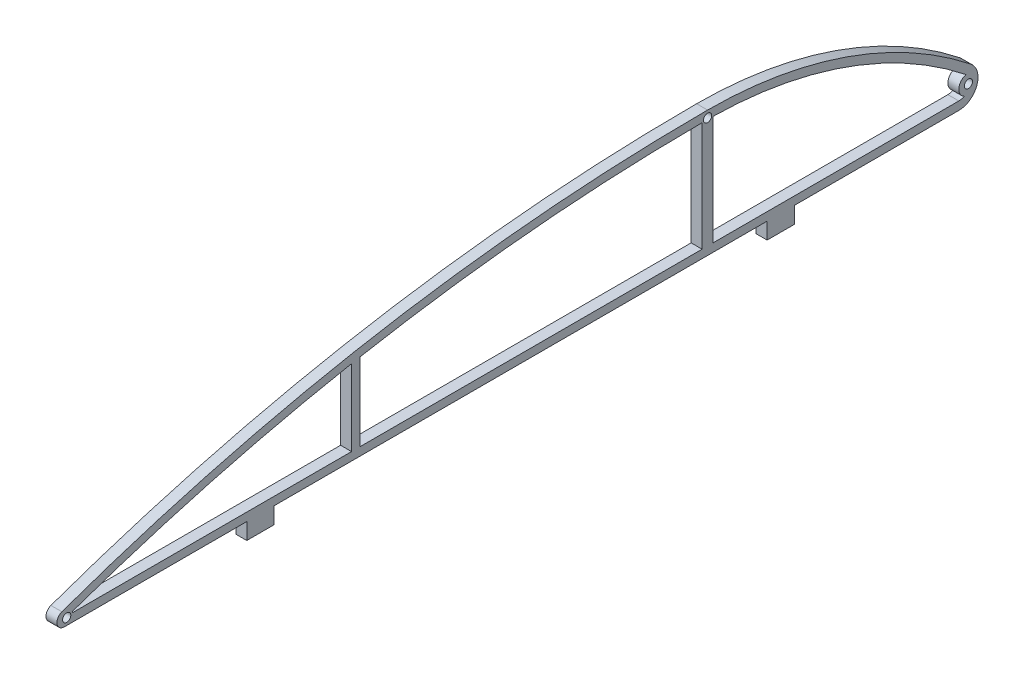
ISO-10303-21;
HEADER;
FILE_DESCRIPTION(('STEP AP214'),'2;1');
FILE_NAME('part.step','',(''),(''),'','','');
FILE_SCHEMA(('AUTOMOTIVE_DESIGN { 1 0 10303 214 1 1 1 1 }'));
ENDSEC;
DATA;
#1=APPLICATION_CONTEXT('core data for automotive mechanical design processes');
#2=APPLICATION_PROTOCOL_DEFINITION('international standard','automotive_design',2000,#1);
#3=PRODUCT_CONTEXT('',#1,'mechanical');
#4=PRODUCT('Part','Part','',(#3));
#5=PRODUCT_RELATED_PRODUCT_CATEGORY('part','',(#4));
#6=PRODUCT_DEFINITION_FORMATION('','',#4);
#7=PRODUCT_DEFINITION_CONTEXT('part definition',#1,'design');
#8=PRODUCT_DEFINITION('design','',#6,#7);
#9=PRODUCT_DEFINITION_SHAPE('','',#8);
#10=(LENGTH_UNIT() NAMED_UNIT(*) SI_UNIT(.MILLI.,.METRE.));
#11=(NAMED_UNIT(*) PLANE_ANGLE_UNIT() SI_UNIT($,.RADIAN.));
#12=(NAMED_UNIT(*) SI_UNIT($,.STERADIAN.) SOLID_ANGLE_UNIT());
#13=UNCERTAINTY_MEASURE_WITH_UNIT(LENGTH_MEASURE(1.E-05),#10,'distance_accuracy_value','');
#14=(GEOMETRIC_REPRESENTATION_CONTEXT(3) GLOBAL_UNCERTAINTY_ASSIGNED_CONTEXT((#13)) GLOBAL_UNIT_ASSIGNED_CONTEXT((#10,
#11,#12)) REPRESENTATION_CONTEXT('',''));
#15=CARTESIAN_POINT('',(0.,0.,0.));
#16=DIRECTION('',(0.,0.,1.));
#17=DIRECTION('',(1.,0.,0.));
#18=AXIS2_PLACEMENT_3D('',#15,#16,#17);
#19=CARTESIAN_POINT('',(2.,0.,0.));
#20=DIRECTION('',(0.,1.,0.));
#21=DIRECTION('',(0.,0.,1.));
#22=AXIS2_PLACEMENT_3D('',#19,#20,#21);
#23=PLANE('',#22);
#24=DIRECTION('',(1.,0.,0.));
#25=VECTOR('',#24,1.);
#26=CARTESIAN_POINT('',(0.,0.,-45.8731710925563));
#27=LINE('',#26,#25);
#28=CARTESIAN_POINT('',(0.,0.,-45.8731710925563));
#29=VERTEX_POINT('',#28);
#30=CARTESIAN_POINT('',(2.,0.,-45.8731710925563));
#31=VERTEX_POINT('',#30);
#32=EDGE_CURVE('E259',#29,#31,#27,.T.);
#33=ORIENTED_EDGE('',*,*,#32,.F.);
#34=DIRECTION('',(0.,0.,-1.));
#35=VECTOR('',#34,1.);
#36=CARTESIAN_POINT('',(0.,0.,0.));
#37=LINE('',#36,#35);
#38=CARTESIAN_POINT('',(0.,0.,-135.873171092556));
#39=VERTEX_POINT('',#38);
#40=EDGE_CURVE('E462',#29,#39,#37,.T.);
#41=ORIENTED_EDGE('',*,*,#40,.T.);
#42=DIRECTION('',(1.,0.,0.));
#43=VECTOR('',#42,1.);
#44=CARTESIAN_POINT('',(0.,0.,-135.873171092556));
#45=LINE('',#44,#43);
#46=CARTESIAN_POINT('',(2.,0.,-135.873171092556));
#47=VERTEX_POINT('',#46);
#48=EDGE_CURVE('E244',#39,#47,#45,.T.);
#49=ORIENTED_EDGE('',*,*,#48,.T.);
#50=DIRECTION('',(0.,0.,-1.));
#51=VECTOR('',#50,1.);
#52=CARTESIAN_POINT('',(2.,0.,0.));
#53=LINE('',#52,#51);
#54=EDGE_CURVE('E451',#31,#47,#53,.T.);
#55=ORIENTED_EDGE('',*,*,#54,.F.);
#56=EDGE_LOOP('',(#33,#41,#49,#55));
#57=FACE_BOUND('',#56,.T.);
#58=ADVANCED_FACE('F43',(#57),#23,.F.);
#59=DIRECTION('',(1.,0.,0.));
#60=VECTOR('',#59,1.);
#61=CARTESIAN_POINT('',(0.,0.,-140.873171092556));
#62=LINE('',#61,#60);
#63=CARTESIAN_POINT('',(0.,0.,-140.873171092556));
#64=VERTEX_POINT('',#63);
#65=CARTESIAN_POINT('',(2.,0.,-140.873171092556));
#66=VERTEX_POINT('',#65);
#67=EDGE_CURVE('E274',#64,#66,#62,.T.);
#68=ORIENTED_EDGE('',*,*,#67,.F.);
#69=CARTESIAN_POINT('',(0.,0.,-170.873171092556));
#70=VERTEX_POINT('',#69);
#71=EDGE_CURVE('E458',#64,#70,#37,.T.);
#72=ORIENTED_EDGE('',*,*,#71,.T.);
#73=DIRECTION('',(-1.,0.,0.));
#74=VECTOR('',#73,1.);
#75=CARTESIAN_POINT('',(2.,0.,-170.873171092556));
#76=LINE('',#75,#74);
#77=CARTESIAN_POINT('',(2.,0.,-170.873171092556));
#78=VERTEX_POINT('',#77);
#79=EDGE_CURVE('E470',#78,#70,#76,.T.);
#80=ORIENTED_EDGE('',*,*,#79,.F.);
#81=EDGE_CURVE('E445',#66,#78,#53,.T.);
#82=ORIENTED_EDGE('',*,*,#81,.F.);
#83=EDGE_LOOP('',(#68,#72,#80,#82));
#84=FACE_BOUND('',#83,.T.);
#85=ADVANCED_FACE('F505',(#84),#23,.F.);
#86=CARTESIAN_POINT('',(2.,-328.173913043478,-125.));
#87=DIRECTION('',(1.,0.,0.));
#88=DIRECTION('',(0.,0.,-1.));
#89=AXIS2_PLACEMENT_3D('',#86,#87,#88);
#90=PLANE('',#89);
#91=CARTESIAN_POINT('',(2.,3.32833729633026,-172.61895883156));
#92=DIRECTION('',(1.,0.,0.));
#93=DIRECTION('',(0.,0.,-1.));
#94=AXIS2_PLACEMENT_3D('',#91,#92,#93);
#95=CIRCLE('',#94,0.750000000000012);
#96=CARTESIAN_POINT('',(2.,3.32833729633026,-173.36895883156));
#97=VERTEX_POINT('',#96);
#98=EDGE_CURVE('E428',#97,#97,#95,.T.);
#99=ORIENTED_EDGE('',*,*,#98,.F.);
#100=EDGE_LOOP('',(#99));
#101=FACE_BOUND('',#100,.T.);
#102=CARTESIAN_POINT('',(2.,21.75,-125.));
#103=DIRECTION('',(1.,0.,0.));
#104=DIRECTION('',(0.,0.,-1.));
#105=AXIS2_PLACEMENT_3D('',#102,#103,#104);
#106=CIRCLE('',#105,0.750000000000012);
#107=CARTESIAN_POINT('',(2.,21.75,-125.75));
#108=VERTEX_POINT('',#107);
#109=EDGE_CURVE('E434',#108,#108,#106,.T.);
#110=ORIENTED_EDGE('',*,*,#109,.F.);
#111=EDGE_LOOP('',(#110));
#112=FACE_BOUND('',#111,.T.);
#113=CARTESIAN_POINT('',(2.,1.25,-8.));
#114=DIRECTION('',(1.,0.,0.));
#115=DIRECTION('',(0.,0.,-1.));
#116=AXIS2_PLACEMENT_3D('',#113,#114,#115);
#117=CIRCLE('',#116,0.75);
#118=CARTESIAN_POINT('',(2.,1.25,-8.75));
#119=VERTEX_POINT('',#118);
#120=EDGE_CURVE('E423',#119,#119,#117,.T.);
#121=ORIENTED_EDGE('',*,*,#120,.F.);
#122=EDGE_LOOP('',(#121));
#123=FACE_BOUND('',#122,.T.);
#124=CARTESIAN_POINT('',(2.,-328.173913043478,-125.));
#125=DIRECTION('',(1.,0.,0.));
#126=DIRECTION('',(0.,0.,-1.));
#127=AXIS2_PLACEMENT_3D('',#124,#125,#126);
#128=CIRCLE('',#127,351.173913043478);
#129=CARTESIAN_POINT('',(2.,23.,-125.));
#130=VERTEX_POINT('',#129);
#131=CARTESIAN_POINT('',(2.,2.62166058700342,-7.11274170314669));
#132=VERTEX_POINT('',#131);
#133=EDGE_CURVE('E442',#130,#132,#128,.T.);
#134=ORIENTED_EDGE('',*,*,#133,.T.);
#135=CARTESIAN_POINT('',(2.,1.35000000000002,-7.56592969003753));
#136=DIRECTION('',(1.,0.,0.));
#137=DIRECTION('',(0.,0.,-1.));
#138=AXIS2_PLACEMENT_3D('',#135,#136,#137);
#139=CIRCLE('',#138,1.35);
#140=CARTESIAN_POINT('',(2.,0.,-7.56592969003753));
#141=VERTEX_POINT('',#140);
#142=EDGE_CURVE('E11',#132,#141,#139,.T.);
#143=ORIENTED_EDGE('',*,*,#142,.T.);
#144=CARTESIAN_POINT('',(2.,0.,-40.8731710925563));
#145=VERTEX_POINT('',#144);
#146=EDGE_CURVE('E447',#141,#145,#53,.T.);
#147=ORIENTED_EDGE('',*,*,#146,.T.);
#148=DIRECTION('',(0.,1.,0.));
#149=VECTOR('',#148,1.);
#150=CARTESIAN_POINT('',(2.,-3.,-40.8731710925563));
#151=LINE('',#150,#149);
#152=CARTESIAN_POINT('',(2.,-3.,-40.8731710925563));
#153=VERTEX_POINT('',#152);
#154=EDGE_CURVE('E265',#153,#145,#151,.T.);
#155=ORIENTED_EDGE('',*,*,#154,.F.);
#156=DIRECTION('',(0.,0.,1.));
#157=VECTOR('',#156,1.);
#158=CARTESIAN_POINT('',(2.,-3.,0.));
#159=LINE('',#158,#157);
#160=CARTESIAN_POINT('',(2.,-3.,-45.8731710925563));
#161=VERTEX_POINT('',#160);
#162=EDGE_CURVE('E257',#161,#153,#159,.T.);
#163=ORIENTED_EDGE('',*,*,#162,.F.);
#164=DIRECTION('',(0.,1.,0.));
#165=VECTOR('',#164,1.);
#166=CARTESIAN_POINT('',(2.,-3.,-45.8731710925563));
#167=LINE('',#166,#165);
#168=EDGE_CURVE('E58',#161,#31,#167,.T.);
#169=ORIENTED_EDGE('',*,*,#168,.T.);
#170=ORIENTED_EDGE('',*,*,#54,.T.);
#171=DIRECTION('',(0.,1.,0.));
#172=VECTOR('',#171,1.);
#173=CARTESIAN_POINT('',(2.,-3.,-135.873171092556));
#174=LINE('',#173,#172);
#175=CARTESIAN_POINT('',(2.,-3.,-135.873171092556));
#176=VERTEX_POINT('',#175);
#177=EDGE_CURVE('E280',#176,#47,#174,.T.);
#178=ORIENTED_EDGE('',*,*,#177,.F.);
#179=DIRECTION('',(0.,0.,1.));
#180=VECTOR('',#179,1.);
#181=CARTESIAN_POINT('',(2.,-3.,0.));
#182=LINE('',#181,#180);
#183=CARTESIAN_POINT('',(2.,-3.,-140.873171092556));
#184=VERTEX_POINT('',#183);
#185=EDGE_CURVE('E278',#184,#176,#182,.T.);
#186=ORIENTED_EDGE('',*,*,#185,.F.);
#187=DIRECTION('',(0.,1.,0.));
#188=VECTOR('',#187,1.);
#189=CARTESIAN_POINT('',(2.,-3.,-140.873171092556));
#190=LINE('',#189,#188);
#191=EDGE_CURVE('E65',#184,#66,#190,.T.);
#192=ORIENTED_EDGE('',*,*,#191,.T.);
#193=ORIENTED_EDGE('',*,*,#81,.T.);
#194=CARTESIAN_POINT('',(2.,3.5,-170.873171092556));
#195=DIRECTION('',(1.,0.,0.));
#196=DIRECTION('',(0.,0.,-1.));
#197=AXIS2_PLACEMENT_3D('',#194,#195,#196);
#198=CIRCLE('',#197,3.50000000000001);
#199=CARTESIAN_POINT('',(2.,6.24078986147951,-173.049882128778));
#200=VERTEX_POINT('',#199);
#201=EDGE_CURVE('E450',#78,#200,#198,.T.);
#202=ORIENTED_EDGE('',*,*,#201,.T.);
#203=CARTESIAN_POINT('',(2.,-54.2608695652168,-125.));
#204=DIRECTION('',(1.,0.,0.));
#205=DIRECTION('',(0.,0.,-1.));
#206=AXIS2_PLACEMENT_3D('',#203,#204,#205);
#207=CIRCLE('',#206,77.2608695652168);
#208=EDGE_CURVE('E453',#200,#130,#207,.T.);
#209=ORIENTED_EDGE('',*,*,#208,.T.);
#210=EDGE_LOOP('',(#134,#143,#147,#155,#163,#169,#170,#178,#186,#192,#193,#202,#209));
#211=FACE_BOUND('',#210,.T.);
#212=CARTESIAN_POINT('',(2.,-328.173913043478,-125.));
#213=DIRECTION('',(1.,0.,0.));
#214=DIRECTION('',(0.,0.,-1.));
#215=AXIS2_PLACEMENT_3D('',#212,#213,#214);
#216=CIRCLE('',#215,349.673913043478);
#217=CARTESIAN_POINT('',(2.,15.6859355331447,-61.5));
#218=VERTEX_POINT('',#217);
#219=CARTESIAN_POINT('',(2.,21.4985003167034,-123.975891605191));
#220=VERTEX_POINT('',#219);
#221=EDGE_CURVE('E384',#218,#220,#216,.F.);
#222=ORIENTED_EDGE('',*,*,#221,.T.);
#223=CARTESIAN_POINT('',(2.,21.9,-125.));
#224=DIRECTION('',(1.,0.,0.));
#225=DIRECTION('',(0.,0.,-1.));
#226=AXIS2_PLACEMENT_3D('',#223,#224,#225);
#227=CIRCLE('',#226,1.10000000000232);
#228=CARTESIAN_POINT('',(2.,21.4417424305001,-124.));
#229=VERTEX_POINT('',#228);
#230=EDGE_CURVE('E387',#220,#229,#227,.T.);
#231=ORIENTED_EDGE('',*,*,#230,.T.);
#232=DIRECTION('',(0.,-1.,0.));
#233=VECTOR('',#232,1.);
#234=CARTESIAN_POINT('',(2.,-328.173913043478,-124.));
#235=LINE('',#234,#233);
#236=CARTESIAN_POINT('',(2.,1.5,-124.));
#237=VERTEX_POINT('',#236);
#238=EDGE_CURVE('E315',#229,#237,#235,.T.);
#239=ORIENTED_EDGE('',*,*,#238,.T.);
#240=DIRECTION('',(0.,0.,1.));
#241=VECTOR('',#240,1.);
#242=CARTESIAN_POINT('',(2.,1.5,-125.));
#243=LINE('',#242,#241);
#244=CARTESIAN_POINT('',(2.,1.49999999999999,-61.5));
#245=VERTEX_POINT('',#244);
#246=EDGE_CURVE('E378',#237,#245,#243,.T.);
#247=ORIENTED_EDGE('',*,*,#246,.T.);
#248=DIRECTION('',(0.,1.,0.));
#249=VECTOR('',#248,1.);
#250=CARTESIAN_POINT('',(2.,-328.173913043478,-61.5));
#251=LINE('',#250,#249);
#252=EDGE_CURVE('E381',#245,#218,#251,.T.);
#253=ORIENTED_EDGE('',*,*,#252,.T.);
#254=EDGE_LOOP('',(#222,#231,#239,#247,#253));
#255=FACE_BOUND('',#254,.T.);
#256=CARTESIAN_POINT('',(2.,21.9,-125.));
#257=DIRECTION('',(1.,0.,0.));
#258=DIRECTION('',(0.,0.,-1.));
#259=AXIS2_PLACEMENT_3D('',#256,#257,#258);
#260=CIRCLE('',#259,1.10000000000039);
#261=CARTESIAN_POINT('',(2.,21.4417424305079,-126.000000000002));
#262=VERTEX_POINT('',#261);
#263=CARTESIAN_POINT('',(2.,21.4931066963523,-126.02197741631));
#264=VERTEX_POINT('',#263);
#265=EDGE_CURVE('E405',#262,#264,#260,.T.);
#266=ORIENTED_EDGE('',*,*,#265,.T.);
#267=CARTESIAN_POINT('',(2.,-54.2608695652168,-125.));
#268=DIRECTION('',(1.,0.,0.));
#269=DIRECTION('',(0.,0.,-1.));
#270=AXIS2_PLACEMENT_3D('',#267,#268,#269);
#271=CIRCLE('',#270,75.7608695652168);
#272=CARTESIAN_POINT('',(2.,5.06616563513115,-172.117005970398));
#273=VERTEX_POINT('',#272);
#274=EDGE_CURVE('E408',#264,#273,#271,.F.);
#275=ORIENTED_EDGE('',*,*,#274,.T.);
#276=CARTESIAN_POINT('',(2.,3.5,-170.873171092556));
#277=DIRECTION('',(1.,0.,0.));
#278=DIRECTION('',(0.,0.,-1.));
#279=AXIS2_PLACEMENT_3D('',#276,#277,#278);
#280=CIRCLE('',#279,2.00000000000001);
#281=CARTESIAN_POINT('',(2.,5.02043214697113,-172.172511727824));
#282=VERTEX_POINT('',#281);
#283=EDGE_CURVE('E390',#273,#282,#280,.F.);
#284=ORIENTED_EDGE('',*,*,#283,.T.);
#285=CARTESIAN_POINT('',(2.,3.32833729633026,-172.61895883156));
#286=DIRECTION('',(1.,0.,0.));
#287=DIRECTION('',(0.,0.,-1.));
#288=AXIS2_PLACEMENT_3D('',#285,#286,#287);
#289=CIRCLE('',#288,1.75);
#290=CARTESIAN_POINT('',(2.,1.75560710555341,-171.851482612372));
#291=VERTEX_POINT('',#290);
#292=EDGE_CURVE('E393',#282,#291,#289,.T.);
#293=ORIENTED_EDGE('',*,*,#292,.T.);
#294=CARTESIAN_POINT('',(2.,3.5,-170.873171092556));
#295=DIRECTION('',(1.,0.,0.));
#296=DIRECTION('',(0.,0.,-1.));
#297=AXIS2_PLACEMENT_3D('',#294,#295,#296);
#298=CIRCLE('',#297,2.);
#299=CARTESIAN_POINT('',(2.,1.5,-170.873171092556));
#300=VERTEX_POINT('',#299);
#301=EDGE_CURVE('E396',#291,#300,#298,.F.);
#302=ORIENTED_EDGE('',*,*,#301,.T.);
#303=DIRECTION('',(0.,0.,1.));
#304=VECTOR('',#303,1.);
#305=CARTESIAN_POINT('',(2.,1.5,-125.));
#306=LINE('',#305,#304);
#307=CARTESIAN_POINT('',(2.,1.50000000000001,-126.));
#308=VERTEX_POINT('',#307);
#309=EDGE_CURVE('E399',#300,#308,#306,.T.);
#310=ORIENTED_EDGE('',*,*,#309,.T.);
#311=DIRECTION('',(0.,1.,0.));
#312=VECTOR('',#311,1.);
#313=CARTESIAN_POINT('',(2.,-328.173913043478,-125.999999999972));
#314=LINE('',#313,#312);
#315=EDGE_CURVE('E402',#308,#262,#314,.T.);
#316=ORIENTED_EDGE('',*,*,#315,.T.);
#317=EDGE_LOOP('',(#266,#275,#284,#293,#302,#310,#316));
#318=FACE_BOUND('',#317,.T.);
#319=DIRECTION('',(0.,0.,1.));
#320=VECTOR('',#319,1.);
#321=CARTESIAN_POINT('',(2.,1.5,-125.));
#322=LINE('',#321,#320);
#323=CARTESIAN_POINT('',(2.,1.49999999999999,-60.));
#324=VERTEX_POINT('',#323);
#325=CARTESIAN_POINT('',(2.,1.5,-9.07121426428143));
#326=VERTEX_POINT('',#325);
#327=EDGE_CURVE('E417',#324,#326,#322,.T.);
#328=ORIENTED_EDGE('',*,*,#327,.T.);
#329=CARTESIAN_POINT('',(2.,1.25,-8.));
#330=DIRECTION('',(1.,0.,0.));
#331=DIRECTION('',(0.,0.,-1.));
#332=AXIS2_PLACEMENT_3D('',#329,#330,#331);
#333=CIRCLE('',#332,1.1);
#334=CARTESIAN_POINT('',(2.,1.69988912104929,-9.00379269710502));
#335=VERTEX_POINT('',#334);
#336=EDGE_CURVE('E420',#326,#335,#333,.T.);
#337=ORIENTED_EDGE('',*,*,#336,.T.);
#338=CARTESIAN_POINT('',(2.,-328.173913043478,-125.));
#339=DIRECTION('',(1.,0.,0.));
#340=DIRECTION('',(0.,0.,-1.));
#341=AXIS2_PLACEMENT_3D('',#338,#339,#340);
#342=CIRCLE('',#341,349.673913043478);
#343=CARTESIAN_POINT('',(2.,15.4055471446099,-60.));
#344=VERTEX_POINT('',#343);
#345=EDGE_CURVE('E411',#335,#344,#342,.F.);
#346=ORIENTED_EDGE('',*,*,#345,.T.);
#347=DIRECTION('',(0.,-1.,0.));
#348=VECTOR('',#347,1.);
#349=CARTESIAN_POINT('',(2.,-328.173913043478,-60.));
#350=LINE('',#349,#348);
#351=EDGE_CURVE('E414',#344,#324,#350,.T.);
#352=ORIENTED_EDGE('',*,*,#351,.T.);
#353=EDGE_LOOP('',(#328,#337,#346,#352));
#354=FACE_BOUND('',#353,.T.);
#355=ADVANCED_FACE('F484',(#101,#112,#123,#211,#255,#318,#354),#90,.T.);
#356=CARTESIAN_POINT('',(0.,-328.173913043478,-125.));
#357=DIRECTION('',(1.,0.,0.));
#358=DIRECTION('',(0.,0.,-1.));
#359=AXIS2_PLACEMENT_3D('',#356,#357,#358);
#360=PLANE('',#359);
#361=CARTESIAN_POINT('',(0.,-54.2608695652168,-125.));
#362=DIRECTION('',(1.,0.,0.));
#363=DIRECTION('',(0.,0.,-1.));
#364=AXIS2_PLACEMENT_3D('',#361,#362,#363);
#365=CIRCLE('',#364,75.7608695652168);
#366=CARTESIAN_POINT('',(0.,5.06616563513115,-172.117005970398));
#367=VERTEX_POINT('',#366);
#368=CARTESIAN_POINT('',(0.,21.4931066963523,-126.02197741631));
#369=VERTEX_POINT('',#368);
#370=EDGE_CURVE('E316',#367,#369,#365,.T.);
#371=ORIENTED_EDGE('',*,*,#370,.T.);
#372=CARTESIAN_POINT('',(0.,21.9,-125.));
#373=DIRECTION('',(-1.,0.,0.));
#374=DIRECTION('',(0.,0.,-1.));
#375=AXIS2_PLACEMENT_3D('',#372,#373,#374);
#376=CIRCLE('',#375,1.10000000000039);
#377=CARTESIAN_POINT('',(0.,21.4417424305079,-126.000000000002));
#378=VERTEX_POINT('',#377);
#379=EDGE_CURVE('E319',#369,#378,#376,.T.);
#380=ORIENTED_EDGE('',*,*,#379,.T.);
#381=DIRECTION('',(0.,-1.,0.));
#382=VECTOR('',#381,1.);
#383=CARTESIAN_POINT('',(0.,21.4417424305081,-126.000000000002));
#384=LINE('',#383,#382);
#385=CARTESIAN_POINT('',(0.,1.50000000000001,-126.));
#386=VERTEX_POINT('',#385);
#387=EDGE_CURVE('E323',#378,#386,#384,.T.);
#388=ORIENTED_EDGE('',*,*,#387,.T.);
#389=DIRECTION('',(0.,0.,-1.));
#390=VECTOR('',#389,1.);
#391=CARTESIAN_POINT('',(0.,1.50000000000001,-126.));
#392=LINE('',#391,#390);
#393=CARTESIAN_POINT('',(0.,1.5,-170.873171092556));
#394=VERTEX_POINT('',#393);
#395=EDGE_CURVE('E326',#386,#394,#392,.T.);
#396=ORIENTED_EDGE('',*,*,#395,.T.);
#397=CARTESIAN_POINT('',(0.,3.5,-170.873171092556));
#398=DIRECTION('',(1.,0.,0.));
#399=DIRECTION('',(0.,0.,-1.));
#400=AXIS2_PLACEMENT_3D('',#397,#398,#399);
#401=CIRCLE('',#400,2.);
#402=CARTESIAN_POINT('',(0.,1.75560710555341,-171.851482612372));
#403=VERTEX_POINT('',#402);
#404=EDGE_CURVE('E329',#394,#403,#401,.T.);
#405=ORIENTED_EDGE('',*,*,#404,.T.);
#406=CARTESIAN_POINT('',(0.,3.32833729633026,-172.61895883156));
#407=DIRECTION('',(-1.,0.,0.));
#408=DIRECTION('',(0.,0.,-1.));
#409=AXIS2_PLACEMENT_3D('',#406,#407,#408);
#410=CIRCLE('',#409,1.75);
#411=CARTESIAN_POINT('',(0.,5.02043214697113,-172.172511727824));
#412=VERTEX_POINT('',#411);
#413=EDGE_CURVE('E332',#403,#412,#410,.T.);
#414=ORIENTED_EDGE('',*,*,#413,.T.);
#415=CARTESIAN_POINT('',(0.,3.5,-170.873171092556));
#416=DIRECTION('',(1.,0.,0.));
#417=DIRECTION('',(0.,0.,-1.));
#418=AXIS2_PLACEMENT_3D('',#415,#416,#417);
#419=CIRCLE('',#418,2.00000000000001);
#420=EDGE_CURVE('E335',#412,#367,#419,.T.);
#421=ORIENTED_EDGE('',*,*,#420,.T.);
#422=EDGE_LOOP('',(#371,#380,#388,#396,#405,#414,#421));
#423=FACE_BOUND('',#422,.T.);
#424=CARTESIAN_POINT('',(0.,0.,-7.56592969003753));
#425=VERTEX_POINT('',#424);
#426=CARTESIAN_POINT('',(0.,0.,-40.8731710925563));
#427=VERTEX_POINT('',#426);
#428=EDGE_CURVE('E459',#425,#427,#37,.T.);
#429=ORIENTED_EDGE('',*,*,#428,.F.);
#430=CARTESIAN_POINT('',(0.,1.35000000000002,-7.56592969003753));
#431=DIRECTION('',(1.,0.,0.));
#432=DIRECTION('',(0.,0.,-1.));
#433=AXIS2_PLACEMENT_3D('',#430,#431,#432);
#434=CIRCLE('',#433,1.35);
#435=CARTESIAN_POINT('',(0.,2.62166058700342,-7.11274170314669));
#436=VERTEX_POINT('',#435);
#437=EDGE_CURVE('E476',#425,#436,#434,.F.);
#438=ORIENTED_EDGE('',*,*,#437,.T.);
#439=CARTESIAN_POINT('',(0.,-328.173913043478,-125.));
#440=DIRECTION('',(1.,0.,0.));
#441=DIRECTION('',(0.,0.,-1.));
#442=AXIS2_PLACEMENT_3D('',#439,#440,#441);
#443=CIRCLE('',#442,351.173913043478);
#444=CARTESIAN_POINT('',(0.,23.,-125.));
#445=VERTEX_POINT('',#444);
#446=EDGE_CURVE('E427',#445,#436,#443,.T.);
#447=ORIENTED_EDGE('',*,*,#446,.F.);
#448=CARTESIAN_POINT('',(0.,-54.2608695652168,-125.));
#449=DIRECTION('',(1.,0.,0.));
#450=DIRECTION('',(0.,0.,-1.));
#451=AXIS2_PLACEMENT_3D('',#448,#449,#450);
#452=CIRCLE('',#451,77.2608695652168);
#453=CARTESIAN_POINT('',(0.,6.24078986147951,-173.049882128778));
#454=VERTEX_POINT('',#453);
#455=EDGE_CURVE('E446',#454,#445,#452,.T.);
#456=ORIENTED_EDGE('',*,*,#455,.F.);
#457=CARTESIAN_POINT('',(0.,3.5,-170.873171092556));
#458=DIRECTION('',(1.,0.,0.));
#459=DIRECTION('',(0.,0.,-1.));
#460=AXIS2_PLACEMENT_3D('',#457,#458,#459);
#461=CIRCLE('',#460,3.50000000000001);
#462=EDGE_CURVE('E461',#70,#454,#461,.T.);
#463=ORIENTED_EDGE('',*,*,#462,.F.);
#464=ORIENTED_EDGE('',*,*,#71,.F.);
#465=DIRECTION('',(0.,1.,0.));
#466=VECTOR('',#465,1.);
#467=CARTESIAN_POINT('',(0.,-3.,-140.873171092556));
#468=LINE('',#467,#466);
#469=CARTESIAN_POINT('',(0.,-3.,-140.873171092556));
#470=VERTEX_POINT('',#469);
#471=EDGE_CURVE('E287',#470,#64,#468,.T.);
#472=ORIENTED_EDGE('',*,*,#471,.F.);
#473=DIRECTION('',(0.,0.,-1.));
#474=VECTOR('',#473,1.);
#475=CARTESIAN_POINT('',(0.,-3.,0.));
#476=LINE('',#475,#474);
#477=CARTESIAN_POINT('',(0.,-3.,-135.873171092556));
#478=VERTEX_POINT('',#477);
#479=EDGE_CURVE('E273',#478,#470,#476,.T.);
#480=ORIENTED_EDGE('',*,*,#479,.F.);
#481=DIRECTION('',(0.,1.,0.));
#482=VECTOR('',#481,1.);
#483=CARTESIAN_POINT('',(0.,-3.,-135.873171092556));
#484=LINE('',#483,#482);
#485=EDGE_CURVE('E289',#478,#39,#484,.T.);
#486=ORIENTED_EDGE('',*,*,#485,.T.);
#487=ORIENTED_EDGE('',*,*,#40,.F.);
#488=DIRECTION('',(0.,1.,0.));
#489=VECTOR('',#488,1.);
#490=CARTESIAN_POINT('',(0.,-3.,-45.8731710925563));
#491=LINE('',#490,#489);
#492=CARTESIAN_POINT('',(0.,-3.,-45.8731710925563));
#493=VERTEX_POINT('',#492);
#494=EDGE_CURVE('E245',#493,#29,#491,.T.);
#495=ORIENTED_EDGE('',*,*,#494,.F.);
#496=DIRECTION('',(0.,0.,-1.));
#497=VECTOR('',#496,1.);
#498=CARTESIAN_POINT('',(0.,-3.,0.));
#499=LINE('',#498,#497);
#500=CARTESIAN_POINT('',(0.,-3.,-40.8731710925563));
#501=VERTEX_POINT('',#500);
#502=EDGE_CURVE('E248',#501,#493,#499,.T.);
#503=ORIENTED_EDGE('',*,*,#502,.F.);
#504=DIRECTION('',(0.,1.,0.));
#505=VECTOR('',#504,1.);
#506=CARTESIAN_POINT('',(0.,-3.,-40.8731710925563));
#507=LINE('',#506,#505);
#508=EDGE_CURVE('E234',#501,#427,#507,.T.);
#509=ORIENTED_EDGE('',*,*,#508,.T.);
#510=EDGE_LOOP('',(#429,#438,#447,#456,#463,#464,#472,#480,#486,#487,#495,#503,#509));
#511=FACE_BOUND('',#510,.T.);
#512=CARTESIAN_POINT('',(0.,1.25,-8.));
#513=DIRECTION('',(1.,0.,0.));
#514=DIRECTION('',(0.,0.,-1.));
#515=AXIS2_PLACEMENT_3D('',#512,#513,#514);
#516=CIRCLE('',#515,0.75);
#517=CARTESIAN_POINT('',(0.,1.25,-8.75));
#518=VERTEX_POINT('',#517);
#519=EDGE_CURVE('E437',#518,#518,#516,.T.);
#520=ORIENTED_EDGE('',*,*,#519,.T.);
#521=EDGE_LOOP('',(#520));
#522=FACE_BOUND('',#521,.T.);
#523=CARTESIAN_POINT('',(0.,21.75,-125.));
#524=DIRECTION('',(1.,0.,0.));
#525=DIRECTION('',(0.,0.,-1.));
#526=AXIS2_PLACEMENT_3D('',#523,#524,#525);
#527=CIRCLE('',#526,0.750000000000012);
#528=CARTESIAN_POINT('',(0.,21.75,-125.75));
#529=VERTEX_POINT('',#528);
#530=EDGE_CURVE('E431',#529,#529,#527,.T.);
#531=ORIENTED_EDGE('',*,*,#530,.T.);
#532=EDGE_LOOP('',(#531));
#533=FACE_BOUND('',#532,.T.);
#534=CARTESIAN_POINT('',(0.,3.32833729633026,-172.61895883156));
#535=DIRECTION('',(1.,0.,0.));
#536=DIRECTION('',(0.,0.,-1.));
#537=AXIS2_PLACEMENT_3D('',#534,#535,#536);
#538=CIRCLE('',#537,0.750000000000012);
#539=CARTESIAN_POINT('',(0.,3.32833729633026,-173.36895883156));
#540=VERTEX_POINT('',#539);
#541=EDGE_CURVE('E424',#540,#540,#538,.T.);
#542=ORIENTED_EDGE('',*,*,#541,.T.);
#543=EDGE_LOOP('',(#542));
#544=FACE_BOUND('',#543,.T.);
#545=CARTESIAN_POINT('',(0.,21.9,-125.));
#546=DIRECTION('',(-1.,0.,0.));
#547=DIRECTION('',(0.,0.,-1.));
#548=AXIS2_PLACEMENT_3D('',#545,#546,#547);
#549=CIRCLE('',#548,1.10000000000232);
#550=CARTESIAN_POINT('',(0.,21.4417424305001,-124.));
#551=VERTEX_POINT('',#550);
#552=CARTESIAN_POINT('',(0.,21.4985003167034,-123.975891605191));
#553=VERTEX_POINT('',#552);
#554=EDGE_CURVE('E292',#551,#553,#549,.T.);
#555=ORIENTED_EDGE('',*,*,#554,.T.);
#556=CARTESIAN_POINT('',(0.,-328.173913043478,-125.));
#557=DIRECTION('',(1.,0.,0.));
#558=DIRECTION('',(0.,0.,-1.));
#559=AXIS2_PLACEMENT_3D('',#556,#557,#558);
#560=CIRCLE('',#559,349.673913043478);
#561=CARTESIAN_POINT('',(0.,15.6859355331447,-61.5));
#562=VERTEX_POINT('',#561);
#563=EDGE_CURVE('E354',#553,#562,#560,.T.);
#564=ORIENTED_EDGE('',*,*,#563,.T.);
#565=DIRECTION('',(0.,-1.,0.));
#566=VECTOR('',#565,1.);
#567=CARTESIAN_POINT('',(0.,1.49999999999999,-61.5));
#568=LINE('',#567,#566);
#569=CARTESIAN_POINT('',(0.,1.49999999999999,-61.5));
#570=VERTEX_POINT('',#569);
#571=EDGE_CURVE('E357',#562,#570,#568,.T.);
#572=ORIENTED_EDGE('',*,*,#571,.T.);
#573=DIRECTION('',(0.,0.,-1.));
#574=VECTOR('',#573,1.);
#575=CARTESIAN_POINT('',(0.,1.49999999999999,-61.5));
#576=LINE('',#575,#574);
#577=CARTESIAN_POINT('',(0.,1.50000000000001,-124.));
#578=VERTEX_POINT('',#577);
#579=EDGE_CURVE('E360',#570,#578,#576,.T.);
#580=ORIENTED_EDGE('',*,*,#579,.T.);
#581=DIRECTION('',(0.,1.,0.));
#582=VECTOR('',#581,1.);
#583=CARTESIAN_POINT('',(0.,21.4417424305001,-124.));
#584=LINE('',#583,#582);
#585=EDGE_CURVE('E363',#578,#551,#584,.T.);
#586=ORIENTED_EDGE('',*,*,#585,.T.);
#587=EDGE_LOOP('',(#555,#564,#572,#580,#586));
#588=FACE_BOUND('',#587,.T.);
#589=CARTESIAN_POINT('',(0.,1.25,-8.));
#590=DIRECTION('',(-1.,0.,0.));
#591=DIRECTION('',(0.,0.,-1.));
#592=AXIS2_PLACEMENT_3D('',#589,#590,#591);
#593=CIRCLE('',#592,1.1);
#594=CARTESIAN_POINT('',(0.,1.69988912104929,-9.00379269710502));
#595=VERTEX_POINT('',#594);
#596=CARTESIAN_POINT('',(0.,1.5,-9.07121426428143));
#597=VERTEX_POINT('',#596);
#598=EDGE_CURVE('E293',#595,#597,#593,.T.);
#599=ORIENTED_EDGE('',*,*,#598,.T.);
#600=DIRECTION('',(0.,0.,-1.));
#601=VECTOR('',#600,1.);
#602=CARTESIAN_POINT('',(0.,1.5,-9.07121426428143));
#603=LINE('',#602,#601);
#604=CARTESIAN_POINT('',(0.,1.49999999999999,-60.));
#605=VERTEX_POINT('',#604);
#606=EDGE_CURVE('E296',#597,#605,#603,.T.);
#607=ORIENTED_EDGE('',*,*,#606,.T.);
#608=DIRECTION('',(0.,1.,0.));
#609=VECTOR('',#608,1.);
#610=CARTESIAN_POINT('',(0.,1.49999999999999,-60.));
#611=LINE('',#610,#609);
#612=CARTESIAN_POINT('',(0.,15.4055471446099,-60.));
#613=VERTEX_POINT('',#612);
#614=EDGE_CURVE('E300',#605,#613,#611,.T.);
#615=ORIENTED_EDGE('',*,*,#614,.T.);
#616=CARTESIAN_POINT('',(0.,-328.173913043478,-125.));
#617=DIRECTION('',(1.,0.,0.));
#618=DIRECTION('',(0.,0.,-1.));
#619=AXIS2_PLACEMENT_3D('',#616,#617,#618);
#620=CIRCLE('',#619,349.673913043478);
#621=EDGE_CURVE('E303',#613,#595,#620,.T.);
#622=ORIENTED_EDGE('',*,*,#621,.T.);
#623=EDGE_LOOP('',(#599,#607,#615,#622));
#624=FACE_BOUND('',#623,.T.);
#625=ADVANCED_FACE('F249',(#423,#511,#522,#533,#544,#588,#624),#360,.F.);
#626=CARTESIAN_POINT('',(2.,-328.173913043478,-125.));
#627=DIRECTION('',(-1.,0.,0.));
#628=DIRECTION('',(0.,0.,1.));
#629=AXIS2_PLACEMENT_3D('',#626,#627,#628);
#630=CYLINDRICAL_SURFACE('',#629,351.173913043478);
#631=ORIENTED_EDGE('',*,*,#446,.T.);
#632=DIRECTION('',(-1.,0.,0.));
#633=VECTOR('',#632,1.);
#634=CARTESIAN_POINT('',(2.,2.62166058700342,-7.11274170314669));
#635=LINE('',#634,#633);
#636=EDGE_CURVE('E51',#436,#132,#635,.F.);
#637=ORIENTED_EDGE('',*,*,#636,.T.);
#638=ORIENTED_EDGE('',*,*,#133,.F.);
#639=DIRECTION('',(-1.,0.,0.));
#640=VECTOR('',#639,1.);
#641=CARTESIAN_POINT('',(2.,23.,-125.));
#642=LINE('',#641,#640);
#643=EDGE_CURVE('E455',#130,#445,#642,.T.);
#644=ORIENTED_EDGE('',*,*,#643,.T.);
#645=EDGE_LOOP('',(#631,#637,#638,#644));
#646=FACE_BOUND('',#645,.T.);
#647=ADVANCED_FACE('F480',(#646),#630,.T.);
#648=ORIENTED_EDGE('',*,*,#428,.T.);
#649=DIRECTION('',(1.,0.,0.));
#650=VECTOR('',#649,1.);
#651=CARTESIAN_POINT('',(0.,0.,-40.8731710925563));
#652=LINE('',#651,#650);
#653=EDGE_CURVE('E240',#427,#145,#652,.T.);
#654=ORIENTED_EDGE('',*,*,#653,.T.);
#655=ORIENTED_EDGE('',*,*,#146,.F.);
#656=DIRECTION('',(-1.,0.,0.));
#657=VECTOR('',#656,1.);
#658=CARTESIAN_POINT('',(2.,0.,-7.56592969003753));
#659=LINE('',#658,#657);
#660=EDGE_CURVE('E473',#141,#425,#659,.T.);
#661=ORIENTED_EDGE('',*,*,#660,.T.);
#662=EDGE_LOOP('',(#648,#654,#655,#661));
#663=FACE_BOUND('',#662,.T.);
#664=ADVANCED_FACE('F491',(#663),#23,.F.);
#665=CARTESIAN_POINT('',(2.,3.5,-170.873171092556));
#666=DIRECTION('',(-1.,0.,0.));
#667=DIRECTION('',(0.,0.,1.));
#668=AXIS2_PLACEMENT_3D('',#665,#666,#667);
#669=CYLINDRICAL_SURFACE('',#668,3.50000000000001);
#670=ORIENTED_EDGE('',*,*,#462,.T.);
#671=DIRECTION('',(-1.,0.,0.));
#672=VECTOR('',#671,1.);
#673=CARTESIAN_POINT('',(2.,6.24078986147951,-173.049882128778));
#674=LINE('',#673,#672);
#675=EDGE_CURVE('E467',#200,#454,#674,.T.);
#676=ORIENTED_EDGE('',*,*,#675,.F.);
#677=ORIENTED_EDGE('',*,*,#201,.F.);
#678=ORIENTED_EDGE('',*,*,#79,.T.);
#679=EDGE_LOOP('',(#670,#676,#677,#678));
#680=FACE_BOUND('',#679,.T.);
#681=ADVANCED_FACE('F500',(#680),#669,.T.);
#682=CARTESIAN_POINT('',(2.,-54.2608695652168,-125.));
#683=DIRECTION('',(-1.,0.,0.));
#684=DIRECTION('',(0.,0.,1.));
#685=AXIS2_PLACEMENT_3D('',#682,#683,#684);
#686=CYLINDRICAL_SURFACE('',#685,77.2608695652168);
#687=ORIENTED_EDGE('',*,*,#455,.T.);
#688=ORIENTED_EDGE('',*,*,#643,.F.);
#689=ORIENTED_EDGE('',*,*,#208,.F.);
#690=ORIENTED_EDGE('',*,*,#675,.T.);
#691=EDGE_LOOP('',(#687,#688,#689,#690));
#692=FACE_BOUND('',#691,.T.);
#693=ADVANCED_FACE('F496',(#692),#686,.T.);
#694=CARTESIAN_POINT('',(0.,1.25,-8.));
#695=DIRECTION('',(1.,0.,0.));
#696=DIRECTION('',(0.,0.,-1.));
#697=AXIS2_PLACEMENT_3D('',#694,#695,#696);
#698=CYLINDRICAL_SURFACE('',#697,0.75);
#699=ORIENTED_EDGE('',*,*,#519,.F.);
#700=EDGE_LOOP('',(#699));
#701=FACE_BOUND('',#700,.T.);
#702=ORIENTED_EDGE('',*,*,#120,.T.);
#703=EDGE_LOOP('',(#702));
#704=FACE_BOUND('',#703,.T.);
#705=ADVANCED_FACE('F555',(#701,#704),#698,.F.);
#706=CARTESIAN_POINT('',(0.,21.75,-125.));
#707=DIRECTION('',(1.,0.,0.));
#708=DIRECTION('',(0.,0.,-1.));
#709=AXIS2_PLACEMENT_3D('',#706,#707,#708);
#710=CYLINDRICAL_SURFACE('',#709,0.750000000000012);
#711=ORIENTED_EDGE('',*,*,#530,.F.);
#712=EDGE_LOOP('',(#711));
#713=FACE_BOUND('',#712,.T.);
#714=ORIENTED_EDGE('',*,*,#109,.T.);
#715=EDGE_LOOP('',(#714));
#716=FACE_BOUND('',#715,.T.);
#717=ADVANCED_FACE('F559',(#713,#716),#710,.F.);
#718=CARTESIAN_POINT('',(0.,3.32833729633026,-172.61895883156));
#719=DIRECTION('',(1.,0.,0.));
#720=DIRECTION('',(0.,0.,-1.));
#721=AXIS2_PLACEMENT_3D('',#718,#719,#720);
#722=CYLINDRICAL_SURFACE('',#721,0.750000000000012);
#723=ORIENTED_EDGE('',*,*,#541,.F.);
#724=EDGE_LOOP('',(#723));
#725=FACE_BOUND('',#724,.T.);
#726=ORIENTED_EDGE('',*,*,#98,.T.);
#727=EDGE_LOOP('',(#726));
#728=FACE_BOUND('',#727,.T.);
#729=ADVANCED_FACE('F564',(#725,#728),#722,.F.);
#730=CARTESIAN_POINT('',(4.,21.9,-125.));
#731=DIRECTION('',(-1.,0.,0.));
#732=DIRECTION('',(0.,0.,1.));
#733=AXIS2_PLACEMENT_3D('',#730,#731,#732);
#734=CYLINDRICAL_SURFACE('',#733,1.10000000000232);
#735=DIRECTION('',(-1.,0.,0.));
#736=VECTOR('',#735,1.);
#737=CARTESIAN_POINT('',(4.,21.4985003167034,-123.975891605191));
#738=LINE('',#737,#736);
#739=EDGE_CURVE('E320',#220,#553,#738,.T.);
#740=ORIENTED_EDGE('',*,*,#739,.T.);
#741=ORIENTED_EDGE('',*,*,#554,.F.);
#742=DIRECTION('',(-1.,0.,0.));
#743=VECTOR('',#742,1.);
#744=CARTESIAN_POINT('',(4.,21.4417424305001,-124.));
#745=LINE('',#744,#743);
#746=EDGE_CURVE('E366',#229,#551,#745,.T.);
#747=ORIENTED_EDGE('',*,*,#746,.F.);
#748=ORIENTED_EDGE('',*,*,#230,.F.);
#749=EDGE_LOOP('',(#740,#741,#747,#748));
#750=FACE_BOUND('',#749,.T.);
#751=ADVANCED_FACE('F572',(#750),#734,.T.);
#752=CARTESIAN_POINT('',(4.,-328.173913043478,-125.));
#753=DIRECTION('',(-1.,0.,0.));
#754=DIRECTION('',(0.,0.,1.));
#755=AXIS2_PLACEMENT_3D('',#752,#753,#754);
#756=CYLINDRICAL_SURFACE('',#755,349.673913043478);
#757=DIRECTION('',(-1.,0.,0.));
#758=VECTOR('',#757,1.);
#759=CARTESIAN_POINT('',(4.,15.6859355331447,-61.5));
#760=LINE('',#759,#758);
#761=EDGE_CURVE('E373',#218,#562,#760,.T.);
#762=ORIENTED_EDGE('',*,*,#761,.T.);
#763=ORIENTED_EDGE('',*,*,#563,.F.);
#764=ORIENTED_EDGE('',*,*,#739,.F.);
#765=ORIENTED_EDGE('',*,*,#221,.F.);
#766=EDGE_LOOP('',(#762,#763,#764,#765));
#767=FACE_BOUND('',#766,.T.);
#768=ADVANCED_FACE('F576',(#767),#756,.F.);
#769=CARTESIAN_POINT('',(4.,1.49999999999999,-61.5));
#770=DIRECTION('',(0.,0.,-1.));
#771=DIRECTION('',(-1.,0.,0.));
#772=AXIS2_PLACEMENT_3D('',#769,#770,#771);
#773=PLANE('',#772);
#774=DIRECTION('',(-1.,0.,0.));
#775=VECTOR('',#774,1.);
#776=CARTESIAN_POINT('',(4.,1.49999999999999,-61.5));
#777=LINE('',#776,#775);
#778=EDGE_CURVE('E371',#245,#570,#777,.T.);
#779=ORIENTED_EDGE('',*,*,#778,.T.);
#780=ORIENTED_EDGE('',*,*,#571,.F.);
#781=ORIENTED_EDGE('',*,*,#761,.F.);
#782=ORIENTED_EDGE('',*,*,#252,.F.);
#783=EDGE_LOOP('',(#779,#780,#781,#782));
#784=FACE_BOUND('',#783,.T.);
#785=ADVANCED_FACE('F580',(#784),#773,.T.);
#786=CARTESIAN_POINT('',(4.,1.49999999999999,-61.5));
#787=DIRECTION('',(0.,1.,0.));
#788=DIRECTION('',(0.,0.,1.));
#789=AXIS2_PLACEMENT_3D('',#786,#787,#788);
#790=PLANE('',#789);
#791=DIRECTION('',(-1.,0.,0.));
#792=VECTOR('',#791,1.);
#793=CARTESIAN_POINT('',(4.,1.50000000000001,-124.));
#794=LINE('',#793,#792);
#795=EDGE_CURVE('E369',#237,#578,#794,.T.);
#796=ORIENTED_EDGE('',*,*,#795,.T.);
#797=ORIENTED_EDGE('',*,*,#579,.F.);
#798=ORIENTED_EDGE('',*,*,#778,.F.);
#799=ORIENTED_EDGE('',*,*,#246,.F.);
#800=EDGE_LOOP('',(#796,#797,#798,#799));
#801=FACE_BOUND('',#800,.T.);
#802=ADVANCED_FACE('F584',(#801),#790,.T.);
#803=CARTESIAN_POINT('',(4.,21.4417424305001,-124.));
#804=DIRECTION('',(0.,0.,1.));
#805=DIRECTION('',(1.,0.,0.));
#806=AXIS2_PLACEMENT_3D('',#803,#804,#805);
#807=PLANE('',#806);
#808=ORIENTED_EDGE('',*,*,#746,.T.);
#809=ORIENTED_EDGE('',*,*,#585,.F.);
#810=ORIENTED_EDGE('',*,*,#795,.F.);
#811=ORIENTED_EDGE('',*,*,#238,.F.);
#812=EDGE_LOOP('',(#808,#809,#810,#811));
#813=FACE_BOUND('',#812,.T.);
#814=ADVANCED_FACE('F588',(#813),#807,.T.);
#815=CARTESIAN_POINT('',(4.,-54.2608695652168,-125.));
#816=DIRECTION('',(-1.,0.,0.));
#817=DIRECTION('',(0.,0.,1.));
#818=AXIS2_PLACEMENT_3D('',#815,#816,#817);
#819=CYLINDRICAL_SURFACE('',#818,75.7608695652168);
#820=DIRECTION('',(-1.,0.,0.));
#821=VECTOR('',#820,1.);
#822=CARTESIAN_POINT('',(4.,21.4931066963523,-126.02197741631));
#823=LINE('',#822,#821);
#824=EDGE_CURVE('E297',#264,#369,#823,.T.);
#825=ORIENTED_EDGE('',*,*,#824,.T.);
#826=ORIENTED_EDGE('',*,*,#370,.F.);
#827=DIRECTION('',(-1.,0.,0.));
#828=VECTOR('',#827,1.);
#829=CARTESIAN_POINT('',(4.,5.06616563513115,-172.117005970398));
#830=LINE('',#829,#828);
#831=EDGE_CURVE('E338',#273,#367,#830,.T.);
#832=ORIENTED_EDGE('',*,*,#831,.F.);
#833=ORIENTED_EDGE('',*,*,#274,.F.);
#834=EDGE_LOOP('',(#825,#826,#832,#833));
#835=FACE_BOUND('',#834,.T.);
#836=ADVANCED_FACE('F592',(#835),#819,.F.);
#837=CARTESIAN_POINT('',(4.,21.9,-125.));
#838=DIRECTION('',(-1.,0.,0.));
#839=DIRECTION('',(0.,0.,1.));
#840=AXIS2_PLACEMENT_3D('',#837,#838,#839);
#841=CYLINDRICAL_SURFACE('',#840,1.10000000000039);
#842=DIRECTION('',(-1.,0.,0.));
#843=VECTOR('',#842,1.);
#844=CARTESIAN_POINT('',(4.,21.4417424305079,-126.000000000002));
#845=LINE('',#844,#843);
#846=EDGE_CURVE('E349',#262,#378,#845,.T.);
#847=ORIENTED_EDGE('',*,*,#846,.T.);
#848=ORIENTED_EDGE('',*,*,#379,.F.);
#849=ORIENTED_EDGE('',*,*,#824,.F.);
#850=ORIENTED_EDGE('',*,*,#265,.F.);
#851=EDGE_LOOP('',(#847,#848,#849,#850));
#852=FACE_BOUND('',#851,.T.);
#853=ADVANCED_FACE('F596',(#852),#841,.T.);
#854=CARTESIAN_POINT('',(4.,21.4417424305081,-126.000000000002));
#855=DIRECTION('',(0.,0.,-1.));
#856=DIRECTION('',(0.,1.,0.));
#857=AXIS2_PLACEMENT_3D('',#854,#855,#856);
#858=PLANE('',#857);
#859=DIRECTION('',(-1.,0.,0.));
#860=VECTOR('',#859,1.);
#861=CARTESIAN_POINT('',(4.,1.50000000000001,-126.));
#862=LINE('',#861,#860);
#863=EDGE_CURVE('E347',#308,#386,#862,.T.);
#864=ORIENTED_EDGE('',*,*,#863,.T.);
#865=ORIENTED_EDGE('',*,*,#387,.F.);
#866=ORIENTED_EDGE('',*,*,#846,.F.);
#867=ORIENTED_EDGE('',*,*,#315,.F.);
#868=EDGE_LOOP('',(#864,#865,#866,#867));
#869=FACE_BOUND('',#868,.T.);
#870=ADVANCED_FACE('F600',(#869),#858,.T.);
#871=CARTESIAN_POINT('',(4.,1.50000000000001,-126.));
#872=DIRECTION('',(0.,1.,0.));
#873=DIRECTION('',(0.,0.,1.));
#874=AXIS2_PLACEMENT_3D('',#871,#872,#873);
#875=PLANE('',#874);
#876=DIRECTION('',(-1.,0.,0.));
#877=VECTOR('',#876,1.);
#878=CARTESIAN_POINT('',(4.,1.5,-170.873171092556));
#879=LINE('',#878,#877);
#880=EDGE_CURVE('E345',#300,#394,#879,.T.);
#881=ORIENTED_EDGE('',*,*,#880,.T.);
#882=ORIENTED_EDGE('',*,*,#395,.F.);
#883=ORIENTED_EDGE('',*,*,#863,.F.);
#884=ORIENTED_EDGE('',*,*,#309,.F.);
#885=EDGE_LOOP('',(#881,#882,#883,#884));
#886=FACE_BOUND('',#885,.T.);
#887=ADVANCED_FACE('F604',(#886),#875,.T.);
#888=CARTESIAN_POINT('',(4.,3.5,-170.873171092556));
#889=DIRECTION('',(-1.,0.,0.));
#890=DIRECTION('',(0.,0.,1.));
#891=AXIS2_PLACEMENT_3D('',#888,#889,#890);
#892=CYLINDRICAL_SURFACE('',#891,2.);
#893=DIRECTION('',(-1.,0.,0.));
#894=VECTOR('',#893,1.);
#895=CARTESIAN_POINT('',(4.,1.75560710555341,-171.851482612372));
#896=LINE('',#895,#894);
#897=EDGE_CURVE('E343',#291,#403,#896,.T.);
#898=ORIENTED_EDGE('',*,*,#897,.T.);
#899=ORIENTED_EDGE('',*,*,#404,.F.);
#900=ORIENTED_EDGE('',*,*,#880,.F.);
#901=ORIENTED_EDGE('',*,*,#301,.F.);
#902=EDGE_LOOP('',(#898,#899,#900,#901));
#903=FACE_BOUND('',#902,.T.);
#904=ADVANCED_FACE('F608',(#903),#892,.F.);
#905=CARTESIAN_POINT('',(4.,3.32833729633026,-172.61895883156));
#906=DIRECTION('',(-1.,0.,0.));
#907=DIRECTION('',(0.,0.,1.));
#908=AXIS2_PLACEMENT_3D('',#905,#906,#907);
#909=CYLINDRICAL_SURFACE('',#908,1.75);
#910=DIRECTION('',(-1.,0.,0.));
#911=VECTOR('',#910,1.);
#912=CARTESIAN_POINT('',(4.,5.02043214697113,-172.172511727824));
#913=LINE('',#912,#911);
#914=EDGE_CURVE('E341',#282,#412,#913,.T.);
#915=ORIENTED_EDGE('',*,*,#914,.T.);
#916=ORIENTED_EDGE('',*,*,#413,.F.);
#917=ORIENTED_EDGE('',*,*,#897,.F.);
#918=ORIENTED_EDGE('',*,*,#292,.F.);
#919=EDGE_LOOP('',(#915,#916,#917,#918));
#920=FACE_BOUND('',#919,.T.);
#921=ADVANCED_FACE('F612',(#920),#909,.T.);
#922=CARTESIAN_POINT('',(4.,3.5,-170.873171092556));
#923=DIRECTION('',(-1.,0.,0.));
#924=DIRECTION('',(0.,0.,1.));
#925=AXIS2_PLACEMENT_3D('',#922,#923,#924);
#926=CYLINDRICAL_SURFACE('',#925,2.00000000000001);
#927=ORIENTED_EDGE('',*,*,#831,.T.);
#928=ORIENTED_EDGE('',*,*,#420,.F.);
#929=ORIENTED_EDGE('',*,*,#914,.F.);
#930=ORIENTED_EDGE('',*,*,#283,.F.);
#931=EDGE_LOOP('',(#927,#928,#929,#930));
#932=FACE_BOUND('',#931,.T.);
#933=ADVANCED_FACE('F616',(#932),#926,.F.);
#934=CARTESIAN_POINT('',(4.,1.25,-8.));
#935=DIRECTION('',(-1.,0.,0.));
#936=DIRECTION('',(0.,0.,1.));
#937=AXIS2_PLACEMENT_3D('',#934,#935,#936);
#938=CYLINDRICAL_SURFACE('',#937,1.1);
#939=DIRECTION('',(-1.,0.,0.));
#940=VECTOR('',#939,1.);
#941=CARTESIAN_POINT('',(4.,1.5,-9.07121426428143));
#942=LINE('',#941,#940);
#943=EDGE_CURVE('E313',#326,#597,#942,.T.);
#944=ORIENTED_EDGE('',*,*,#943,.T.);
#945=ORIENTED_EDGE('',*,*,#598,.F.);
#946=DIRECTION('',(-1.,0.,0.));
#947=VECTOR('',#946,1.);
#948=CARTESIAN_POINT('',(4.,1.69988912104929,-9.00379269710502));
#949=LINE('',#948,#947);
#950=EDGE_CURVE('E306',#335,#595,#949,.T.);
#951=ORIENTED_EDGE('',*,*,#950,.F.);
#952=ORIENTED_EDGE('',*,*,#336,.F.);
#953=EDGE_LOOP('',(#944,#945,#951,#952));
#954=FACE_BOUND('',#953,.T.);
#955=ADVANCED_FACE('F620',(#954),#938,.T.);
#956=CARTESIAN_POINT('',(4.,1.5,-9.07121426428143));
#957=DIRECTION('',(0.,1.,0.));
#958=DIRECTION('',(0.,0.,1.));
#959=AXIS2_PLACEMENT_3D('',#956,#957,#958);
#960=PLANE('',#959);
#961=DIRECTION('',(-1.,0.,0.));
#962=VECTOR('',#961,1.);
#963=CARTESIAN_POINT('',(4.,1.49999999999999,-60.));
#964=LINE('',#963,#962);
#965=EDGE_CURVE('E311',#324,#605,#964,.T.);
#966=ORIENTED_EDGE('',*,*,#965,.T.);
#967=ORIENTED_EDGE('',*,*,#606,.F.);
#968=ORIENTED_EDGE('',*,*,#943,.F.);
#969=ORIENTED_EDGE('',*,*,#327,.F.);
#970=EDGE_LOOP('',(#966,#967,#968,#969));
#971=FACE_BOUND('',#970,.T.);
#972=ADVANCED_FACE('F624',(#971),#960,.T.);
#973=CARTESIAN_POINT('',(4.,1.49999999999999,-60.));
#974=DIRECTION('',(0.,0.,1.));
#975=DIRECTION('',(1.,0.,0.));
#976=AXIS2_PLACEMENT_3D('',#973,#974,#975);
#977=PLANE('',#976);
#978=DIRECTION('',(-1.,0.,0.));
#979=VECTOR('',#978,1.);
#980=CARTESIAN_POINT('',(4.,15.4055471446099,-60.));
#981=LINE('',#980,#979);
#982=EDGE_CURVE('E309',#344,#613,#981,.T.);
#983=ORIENTED_EDGE('',*,*,#982,.T.);
#984=ORIENTED_EDGE('',*,*,#614,.F.);
#985=ORIENTED_EDGE('',*,*,#965,.F.);
#986=ORIENTED_EDGE('',*,*,#351,.F.);
#987=EDGE_LOOP('',(#983,#984,#985,#986));
#988=FACE_BOUND('',#987,.T.);
#989=ADVANCED_FACE('F628',(#988),#977,.T.);
#990=CARTESIAN_POINT('',(4.,-328.173913043478,-125.));
#991=DIRECTION('',(-1.,0.,0.));
#992=DIRECTION('',(0.,0.,1.));
#993=AXIS2_PLACEMENT_3D('',#990,#991,#992);
#994=CYLINDRICAL_SURFACE('',#993,349.673913043478);
#995=ORIENTED_EDGE('',*,*,#950,.T.);
#996=ORIENTED_EDGE('',*,*,#621,.F.);
#997=ORIENTED_EDGE('',*,*,#982,.F.);
#998=ORIENTED_EDGE('',*,*,#345,.F.);
#999=EDGE_LOOP('',(#995,#996,#997,#998));
#1000=FACE_BOUND('',#999,.T.);
#1001=ADVANCED_FACE('F632',(#1000),#994,.F.);
#1002=CARTESIAN_POINT('',(2.,1.35000000000002,-7.56592969003753));
#1003=DIRECTION('',(-1.,0.,0.));
#1004=DIRECTION('',(0.,0.,1.));
#1005=AXIS2_PLACEMENT_3D('',#1002,#1003,#1004);
#1006=CYLINDRICAL_SURFACE('',#1005,1.35);
#1007=ORIENTED_EDGE('',*,*,#142,.F.);
#1008=ORIENTED_EDGE('',*,*,#636,.F.);
#1009=ORIENTED_EDGE('',*,*,#437,.F.);
#1010=ORIENTED_EDGE('',*,*,#660,.F.);
#1011=EDGE_LOOP('',(#1007,#1008,#1009,#1010));
#1012=FACE_BOUND('',#1011,.T.);
#1013=ADVANCED_FACE('F45',(#1012),#1006,.T.);
#1014=CARTESIAN_POINT('',(0.,-3.,-135.873171092556));
#1015=DIRECTION('',(0.,0.,1.));
#1016=DIRECTION('',(1.,0.,0.));
#1017=AXIS2_PLACEMENT_3D('',#1014,#1015,#1016);
#1018=PLANE('',#1017);
#1019=ORIENTED_EDGE('',*,*,#48,.F.);
#1020=ORIENTED_EDGE('',*,*,#485,.F.);
#1021=DIRECTION('',(1.,0.,0.));
#1022=VECTOR('',#1021,1.);
#1023=CARTESIAN_POINT('',(0.,-3.,-135.873171092556));
#1024=LINE('',#1023,#1022);
#1025=EDGE_CURVE('E270',#478,#176,#1024,.T.);
#1026=ORIENTED_EDGE('',*,*,#1025,.T.);
#1027=ORIENTED_EDGE('',*,*,#177,.T.);
#1028=EDGE_LOOP('',(#1019,#1020,#1026,#1027));
#1029=FACE_BOUND('',#1028,.T.);
#1030=ADVANCED_FACE('F514',(#1029),#1018,.T.);
#1031=CARTESIAN_POINT('',(0.,-3.,-140.873171092556));
#1032=DIRECTION('',(0.,0.,1.));
#1033=DIRECTION('',(1.,0.,0.));
#1034=AXIS2_PLACEMENT_3D('',#1031,#1032,#1033);
#1035=PLANE('',#1034);
#1036=ORIENTED_EDGE('',*,*,#67,.T.);
#1037=ORIENTED_EDGE('',*,*,#191,.F.);
#1038=DIRECTION('',(1.,0.,0.));
#1039=VECTOR('',#1038,1.);
#1040=CARTESIAN_POINT('',(0.,-3.,-140.873171092556));
#1041=LINE('',#1040,#1039);
#1042=EDGE_CURVE('E276',#470,#184,#1041,.T.);
#1043=ORIENTED_EDGE('',*,*,#1042,.F.);
#1044=ORIENTED_EDGE('',*,*,#471,.T.);
#1045=EDGE_LOOP('',(#1036,#1037,#1043,#1044));
#1046=FACE_BOUND('',#1045,.T.);
#1047=ADVANCED_FACE('F520',(#1046),#1035,.F.);
#1048=CARTESIAN_POINT('',(0.,-3.,0.));
#1049=DIRECTION('',(0.,-1.,0.));
#1050=DIRECTION('',(0.,0.,-1.));
#1051=AXIS2_PLACEMENT_3D('',#1048,#1049,#1050);
#1052=PLANE('',#1051);
#1053=ORIENTED_EDGE('',*,*,#1025,.F.);
#1054=ORIENTED_EDGE('',*,*,#479,.T.);
#1055=ORIENTED_EDGE('',*,*,#1042,.T.);
#1056=ORIENTED_EDGE('',*,*,#185,.T.);
#1057=EDGE_LOOP('',(#1053,#1054,#1055,#1056));
#1058=FACE_BOUND('',#1057,.T.);
#1059=ADVANCED_FACE('F517',(#1058),#1052,.T.);
#1060=CARTESIAN_POINT('',(0.,-3.,-40.8731710925563));
#1061=DIRECTION('',(0.,0.,1.));
#1062=DIRECTION('',(1.,0.,0.));
#1063=AXIS2_PLACEMENT_3D('',#1060,#1061,#1062);
#1064=PLANE('',#1063);
#1065=ORIENTED_EDGE('',*,*,#653,.F.);
#1066=ORIENTED_EDGE('',*,*,#508,.F.);
#1067=DIRECTION('',(1.,0.,0.));
#1068=VECTOR('',#1067,1.);
#1069=CARTESIAN_POINT('',(0.,-3.,-40.8731710925563));
#1070=LINE('',#1069,#1068);
#1071=EDGE_CURVE('E238',#501,#153,#1070,.T.);
#1072=ORIENTED_EDGE('',*,*,#1071,.T.);
#1073=ORIENTED_EDGE('',*,*,#154,.T.);
#1074=EDGE_LOOP('',(#1065,#1066,#1072,#1073));
#1075=FACE_BOUND('',#1074,.T.);
#1076=ADVANCED_FACE('F236',(#1075),#1064,.T.);
#1077=CARTESIAN_POINT('',(0.,-3.,-45.8731710925563));
#1078=DIRECTION('',(0.,0.,1.));
#1079=DIRECTION('',(1.,0.,0.));
#1080=AXIS2_PLACEMENT_3D('',#1077,#1078,#1079);
#1081=PLANE('',#1080);
#1082=ORIENTED_EDGE('',*,*,#32,.T.);
#1083=ORIENTED_EDGE('',*,*,#168,.F.);
#1084=DIRECTION('',(1.,0.,0.));
#1085=VECTOR('',#1084,1.);
#1086=CARTESIAN_POINT('',(0.,-3.,-45.8731710925563));
#1087=LINE('',#1086,#1085);
#1088=EDGE_CURVE('E254',#493,#161,#1087,.T.);
#1089=ORIENTED_EDGE('',*,*,#1088,.F.);
#1090=ORIENTED_EDGE('',*,*,#494,.T.);
#1091=EDGE_LOOP('',(#1082,#1083,#1089,#1090));
#1092=FACE_BOUND('',#1091,.T.);
#1093=ADVANCED_FACE('F702',(#1092),#1081,.F.);
#1094=CARTESIAN_POINT('',(0.,-3.,0.));
#1095=DIRECTION('',(0.,-1.,0.));
#1096=DIRECTION('',(0.,0.,-1.));
#1097=AXIS2_PLACEMENT_3D('',#1094,#1095,#1096);
#1098=PLANE('',#1097);
#1099=ORIENTED_EDGE('',*,*,#1071,.F.);
#1100=ORIENTED_EDGE('',*,*,#502,.T.);
#1101=ORIENTED_EDGE('',*,*,#1088,.T.);
#1102=ORIENTED_EDGE('',*,*,#162,.T.);
#1103=EDGE_LOOP('',(#1099,#1100,#1101,#1102));
#1104=FACE_BOUND('',#1103,.T.);
#1105=ADVANCED_FACE('F256',(#1104),#1098,.T.);
#1106=CLOSED_SHELL('',(#58,#85,#355,#625,#647,#664,#681,#693,#705,#717,#729,#751,#768,#785,#802,
#814,#836,#853,#870,#887,#904,#921,#933,#955,#972,#989,#1001,#1013,#1030,#1047,#1059,#1076,
#1093,#1105));
#1107=MANIFOLD_SOLID_BREP('B2',#1106);
#1108=ADVANCED_BREP_SHAPE_REPRESENTATION('',(#18,#1107),#14);
#1109=SHAPE_DEFINITION_REPRESENTATION(#9,#1108);
ENDSEC;
END-ISO-10303-21;
